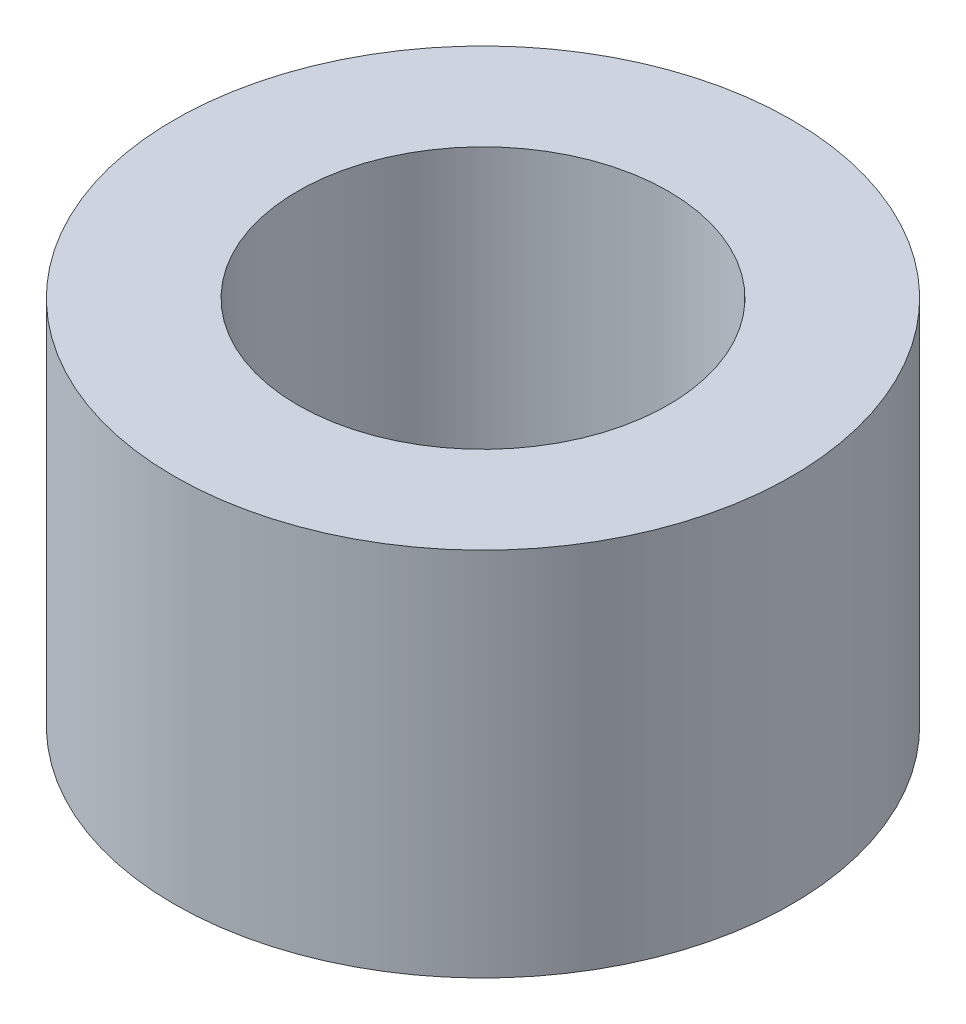
ISO-10303-21;
HEADER;
FILE_DESCRIPTION(('STEP AP214'),'2;1');
FILE_NAME('part.step','',(''),(''),'','','');
FILE_SCHEMA(('AUTOMOTIVE_DESIGN { 1 0 10303 214 1 1 1 1 }'));
ENDSEC;
DATA;
#1=APPLICATION_CONTEXT('core data for automotive mechanical design processes');
#2=APPLICATION_PROTOCOL_DEFINITION('international standard','automotive_design',2000,#1);
#3=PRODUCT_CONTEXT('',#1,'mechanical');
#4=PRODUCT('Part','Part','',(#3));
#5=PRODUCT_RELATED_PRODUCT_CATEGORY('part','',(#4));
#6=PRODUCT_DEFINITION_FORMATION('','',#4);
#7=PRODUCT_DEFINITION_CONTEXT('part definition',#1,'design');
#8=PRODUCT_DEFINITION('design','',#6,#7);
#9=PRODUCT_DEFINITION_SHAPE('','',#8);
#10=(LENGTH_UNIT() NAMED_UNIT(*) SI_UNIT(.MILLI.,.METRE.));
#11=(NAMED_UNIT(*) PLANE_ANGLE_UNIT() SI_UNIT($,.RADIAN.));
#12=(NAMED_UNIT(*) SI_UNIT($,.STERADIAN.) SOLID_ANGLE_UNIT());
#13=UNCERTAINTY_MEASURE_WITH_UNIT(LENGTH_MEASURE(1.E-05),#10,'distance_accuracy_value','');
#14=(GEOMETRIC_REPRESENTATION_CONTEXT(3) GLOBAL_UNCERTAINTY_ASSIGNED_CONTEXT((#13)) GLOBAL_UNIT_ASSIGNED_CONTEXT((#10,
#11,#12)) REPRESENTATION_CONTEXT('',''));
#15=CARTESIAN_POINT('',(0.,0.,0.));
#16=DIRECTION('',(0.,0.,1.));
#17=DIRECTION('',(1.,0.,0.));
#18=AXIS2_PLACEMENT_3D('',#15,#16,#17);
#19=CARTESIAN_POINT('',(0.,3.,0.));
#20=DIRECTION('',(0.,1.,0.));
#21=DIRECTION('',(0.,0.,1.));
#22=AXIS2_PLACEMENT_3D('',#19,#20,#21);
#23=PLANE('',#22);
#24=CARTESIAN_POINT('',(0.,3.,0.));
#25=DIRECTION('',(0.,1.,0.));
#26=DIRECTION('',(0.,0.,1.));
#27=AXIS2_PLACEMENT_3D('',#24,#25,#26);
#28=CIRCLE('',#27,2.5);
#29=CARTESIAN_POINT('',(0.,3.,2.5));
#30=VERTEX_POINT('',#29);
#31=EDGE_CURVE('E10',#30,#30,#28,.T.);
#32=ORIENTED_EDGE('',*,*,#31,.T.);
#33=EDGE_LOOP('',(#32));
#34=FACE_BOUND('',#33,.T.);
#35=CARTESIAN_POINT('',(0.,3.,0.));
#36=DIRECTION('',(0.,1.,0.));
#37=DIRECTION('',(0.,0.,1.));
#38=AXIS2_PLACEMENT_3D('',#35,#36,#37);
#39=CIRCLE('',#38,1.5);
#40=CARTESIAN_POINT('',(0.,3.,1.5));
#41=VERTEX_POINT('',#40);
#42=EDGE_CURVE('E48',#41,#41,#39,.T.);
#43=ORIENTED_EDGE('',*,*,#42,.F.);
#44=EDGE_LOOP('',(#43));
#45=FACE_BOUND('',#44,.T.);
#46=ADVANCED_FACE('F37',(#34,#45),#23,.T.);
#47=CARTESIAN_POINT('',(0.,0.,0.));
#48=DIRECTION('',(0.,1.,0.));
#49=DIRECTION('',(0.,0.,1.));
#50=AXIS2_PLACEMENT_3D('',#47,#48,#49);
#51=PLANE('',#50);
#52=CARTESIAN_POINT('',(0.,0.,0.));
#53=DIRECTION('',(0.,1.,0.));
#54=DIRECTION('',(0.,0.,1.));
#55=AXIS2_PLACEMENT_3D('',#52,#53,#54);
#56=CIRCLE('',#55,2.5);
#57=CARTESIAN_POINT('',(0.,0.,2.5));
#58=VERTEX_POINT('',#57);
#59=EDGE_CURVE('E41',#58,#58,#56,.T.);
#60=ORIENTED_EDGE('',*,*,#59,.F.);
#61=EDGE_LOOP('',(#60));
#62=FACE_BOUND('',#61,.T.);
#63=CARTESIAN_POINT('',(0.,0.,0.));
#64=DIRECTION('',(0.,1.,0.));
#65=DIRECTION('',(0.,0.,1.));
#66=AXIS2_PLACEMENT_3D('',#63,#64,#65);
#67=CIRCLE('',#66,1.5);
#68=CARTESIAN_POINT('',(0.,0.,1.5));
#69=VERTEX_POINT('',#68);
#70=EDGE_CURVE('E50',#69,#69,#67,.T.);
#71=ORIENTED_EDGE('',*,*,#70,.T.);
#72=EDGE_LOOP('',(#71));
#73=FACE_BOUND('',#72,.T.);
#74=ADVANCED_FACE('F60',(#62,#73),#51,.F.);
#75=CARTESIAN_POINT('',(0.,3.,0.));
#76=DIRECTION('',(0.,-1.,0.));
#77=DIRECTION('',(0.,0.,-1.));
#78=AXIS2_PLACEMENT_3D('',#75,#76,#77);
#79=CYLINDRICAL_SURFACE('',#78,2.5);
#80=ORIENTED_EDGE('',*,*,#31,.F.);
#81=EDGE_LOOP('',(#80));
#82=FACE_BOUND('',#81,.T.);
#83=ORIENTED_EDGE('',*,*,#59,.T.);
#84=EDGE_LOOP('',(#83));
#85=FACE_BOUND('',#84,.T.);
#86=ADVANCED_FACE('F39',(#82,#85),#79,.T.);
#87=CARTESIAN_POINT('',(0.,3.,0.));
#88=DIRECTION('',(0.,-1.,0.));
#89=DIRECTION('',(0.,0.,-1.));
#90=AXIS2_PLACEMENT_3D('',#87,#88,#89);
#91=CYLINDRICAL_SURFACE('',#90,1.5);
#92=ORIENTED_EDGE('',*,*,#42,.T.);
#93=EDGE_LOOP('',(#92));
#94=FACE_BOUND('',#93,.T.);
#95=ORIENTED_EDGE('',*,*,#70,.F.);
#96=EDGE_LOOP('',(#95));
#97=FACE_BOUND('',#96,.T.);
#98=ADVANCED_FACE('F56',(#94,#97),#91,.F.);
#99=CLOSED_SHELL('',(#46,#74,#86,#98));
#100=MANIFOLD_SOLID_BREP('B2',#99);
#101=ADVANCED_BREP_SHAPE_REPRESENTATION('',(#18,#100),#14);
#102=SHAPE_DEFINITION_REPRESENTATION(#9,#101);
ENDSEC;
END-ISO-10303-21;
